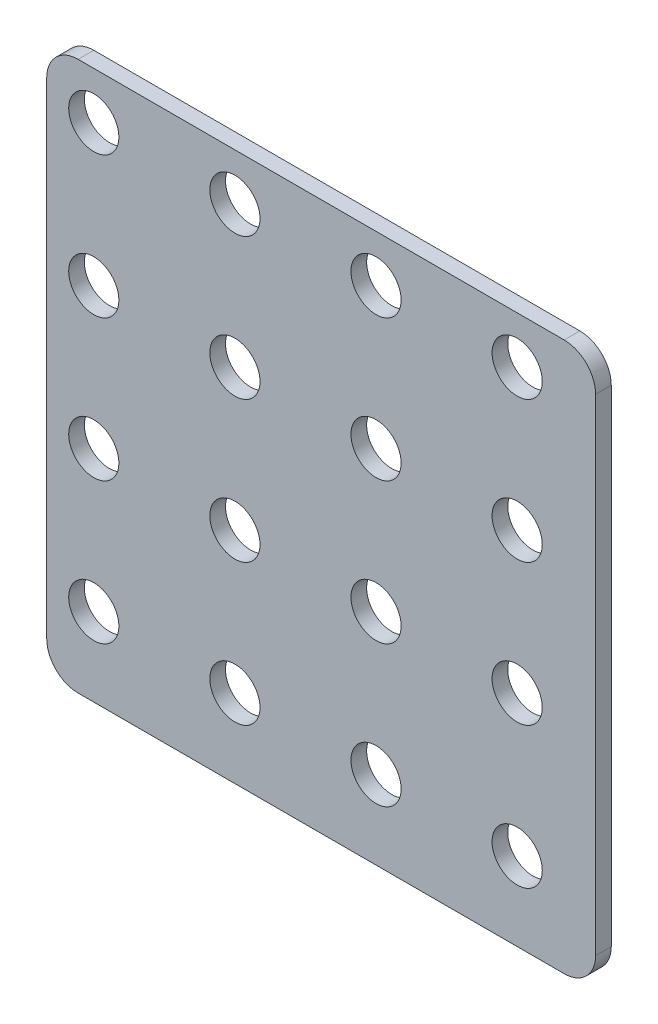
ISO-10303-21;
HEADER;
FILE_DESCRIPTION(('STEP AP214'),'2;1');
FILE_NAME('part.step','',(''),(''),'','','');
FILE_SCHEMA(('AUTOMOTIVE_DESIGN { 1 0 10303 214 1 1 1 1 }'));
ENDSEC;
DATA;
#1=APPLICATION_CONTEXT('core data for automotive mechanical design processes');
#2=APPLICATION_PROTOCOL_DEFINITION('international standard','automotive_design',2000,#1);
#3=PRODUCT_CONTEXT('',#1,'mechanical');
#4=PRODUCT('Part','Part','',(#3));
#5=PRODUCT_RELATED_PRODUCT_CATEGORY('part','',(#4));
#6=PRODUCT_DEFINITION_FORMATION('','',#4);
#7=PRODUCT_DEFINITION_CONTEXT('part definition',#1,'design');
#8=PRODUCT_DEFINITION('design','',#6,#7);
#9=PRODUCT_DEFINITION_SHAPE('','',#8);
#10=(LENGTH_UNIT() NAMED_UNIT(*) SI_UNIT(.MILLI.,.METRE.));
#11=(NAMED_UNIT(*) PLANE_ANGLE_UNIT() SI_UNIT($,.RADIAN.));
#12=(NAMED_UNIT(*) SI_UNIT($,.STERADIAN.) SOLID_ANGLE_UNIT());
#13=UNCERTAINTY_MEASURE_WITH_UNIT(LENGTH_MEASURE(1.E-05),#10,'distance_accuracy_value','');
#14=(GEOMETRIC_REPRESENTATION_CONTEXT(3) GLOBAL_UNCERTAINTY_ASSIGNED_CONTEXT((#13)) GLOBAL_UNIT_ASSIGNED_CONTEXT((#10,
#11,#12)) REPRESENTATION_CONTEXT('',''));
#15=CARTESIAN_POINT('',(0.,0.,0.));
#16=DIRECTION('',(0.,0.,1.));
#17=DIRECTION('',(1.,0.,0.));
#18=AXIS2_PLACEMENT_3D('',#15,#16,#17);
#19=CARTESIAN_POINT('',(30.,5.,0.));
#20=DIRECTION('',(0.,0.,1.));
#21=DIRECTION('',(1.,0.,0.));
#22=AXIS2_PLACEMENT_3D('',#19,#20,#21);
#23=CYLINDRICAL_SURFACE('',#22,1.6);
#24=CARTESIAN_POINT('',(30.,5.,0.));
#25=DIRECTION('',(0.,0.,1.));
#26=DIRECTION('',(1.,0.,0.));
#27=AXIS2_PLACEMENT_3D('',#24,#25,#26);
#28=CIRCLE('',#27,1.6);
#29=CARTESIAN_POINT('',(31.6,5.,0.));
#30=VERTEX_POINT('',#29);
#31=EDGE_CURVE('E262',#30,#30,#28,.T.);
#32=ORIENTED_EDGE('',*,*,#31,.F.);
#33=EDGE_LOOP('',(#32));
#34=FACE_BOUND('',#33,.T.);
#35=CARTESIAN_POINT('',(30.,5.,1.));
#36=DIRECTION('',(0.,0.,-1.));
#37=DIRECTION('',(-1.,0.,0.));
#38=AXIS2_PLACEMENT_3D('',#35,#36,#37);
#39=CIRCLE('',#38,1.6);
#40=CARTESIAN_POINT('',(28.4,5.,1.));
#41=VERTEX_POINT('',#40);
#42=EDGE_CURVE('E266',#41,#41,#39,.T.);
#43=ORIENTED_EDGE('',*,*,#42,.F.);
#44=EDGE_LOOP('',(#43));
#45=FACE_BOUND('',#44,.T.);
#46=ADVANCED_FACE('F45',(#34,#45),#23,.F.);
#47=CARTESIAN_POINT('',(21.,5.,0.));
#48=DIRECTION('',(0.,0.,1.));
#49=DIRECTION('',(1.,0.,0.));
#50=AXIS2_PLACEMENT_3D('',#47,#48,#49);
#51=CYLINDRICAL_SURFACE('',#50,1.6);
#52=CARTESIAN_POINT('',(21.,5.,0.));
#53=DIRECTION('',(0.,0.,1.));
#54=DIRECTION('',(1.,0.,0.));
#55=AXIS2_PLACEMENT_3D('',#52,#53,#54);
#56=CIRCLE('',#55,1.6);
#57=CARTESIAN_POINT('',(22.6,5.,0.));
#58=VERTEX_POINT('',#57);
#59=EDGE_CURVE('E254',#58,#58,#56,.T.);
#60=ORIENTED_EDGE('',*,*,#59,.F.);
#61=EDGE_LOOP('',(#60));
#62=FACE_BOUND('',#61,.T.);
#63=CARTESIAN_POINT('',(21.,5.,1.));
#64=DIRECTION('',(0.,0.,-1.));
#65=DIRECTION('',(-1.,0.,0.));
#66=AXIS2_PLACEMENT_3D('',#63,#64,#65);
#67=CIRCLE('',#66,1.6);
#68=CARTESIAN_POINT('',(19.4,5.,1.));
#69=VERTEX_POINT('',#68);
#70=EDGE_CURVE('E258',#69,#69,#67,.T.);
#71=ORIENTED_EDGE('',*,*,#70,.F.);
#72=EDGE_LOOP('',(#71));
#73=FACE_BOUND('',#72,.T.);
#74=ADVANCED_FACE('F374',(#62,#73),#51,.F.);
#75=CARTESIAN_POINT('',(12.,5.,0.));
#76=DIRECTION('',(0.,0.,1.));
#77=DIRECTION('',(1.,0.,0.));
#78=AXIS2_PLACEMENT_3D('',#75,#76,#77);
#79=CYLINDRICAL_SURFACE('',#78,1.6);
#80=CARTESIAN_POINT('',(12.,5.,0.));
#81=DIRECTION('',(0.,0.,1.));
#82=DIRECTION('',(1.,0.,0.));
#83=AXIS2_PLACEMENT_3D('',#80,#81,#82);
#84=CIRCLE('',#83,1.6);
#85=CARTESIAN_POINT('',(13.6,5.,0.));
#86=VERTEX_POINT('',#85);
#87=EDGE_CURVE('E246',#86,#86,#84,.T.);
#88=ORIENTED_EDGE('',*,*,#87,.F.);
#89=EDGE_LOOP('',(#88));
#90=FACE_BOUND('',#89,.T.);
#91=CARTESIAN_POINT('',(12.,5.,1.));
#92=DIRECTION('',(0.,0.,-1.));
#93=DIRECTION('',(-1.,0.,0.));
#94=AXIS2_PLACEMENT_3D('',#91,#92,#93);
#95=CIRCLE('',#94,1.6);
#96=CARTESIAN_POINT('',(10.4,5.,1.));
#97=VERTEX_POINT('',#96);
#98=EDGE_CURVE('E250',#97,#97,#95,.T.);
#99=ORIENTED_EDGE('',*,*,#98,.F.);
#100=EDGE_LOOP('',(#99));
#101=FACE_BOUND('',#100,.T.);
#102=ADVANCED_FACE('F381',(#90,#101),#79,.F.);
#103=CARTESIAN_POINT('',(3.,5.,0.));
#104=DIRECTION('',(0.,0.,1.));
#105=DIRECTION('',(1.,0.,0.));
#106=AXIS2_PLACEMENT_3D('',#103,#104,#105);
#107=CYLINDRICAL_SURFACE('',#106,1.6);
#108=CARTESIAN_POINT('',(3.,5.,0.));
#109=DIRECTION('',(0.,0.,1.));
#110=DIRECTION('',(1.,0.,0.));
#111=AXIS2_PLACEMENT_3D('',#108,#109,#110);
#112=CIRCLE('',#111,1.6);
#113=CARTESIAN_POINT('',(4.6,5.,0.));
#114=VERTEX_POINT('',#113);
#115=EDGE_CURVE('E238',#114,#114,#112,.T.);
#116=ORIENTED_EDGE('',*,*,#115,.F.);
#117=EDGE_LOOP('',(#116));
#118=FACE_BOUND('',#117,.T.);
#119=CARTESIAN_POINT('',(3.,5.,1.));
#120=DIRECTION('',(0.,0.,-1.));
#121=DIRECTION('',(-1.,0.,0.));
#122=AXIS2_PLACEMENT_3D('',#119,#120,#121);
#123=CIRCLE('',#122,1.6);
#124=CARTESIAN_POINT('',(1.4,5.,1.));
#125=VERTEX_POINT('',#124);
#126=EDGE_CURVE('E242',#125,#125,#123,.T.);
#127=ORIENTED_EDGE('',*,*,#126,.F.);
#128=EDGE_LOOP('',(#127));
#129=FACE_BOUND('',#128,.T.);
#130=ADVANCED_FACE('F454',(#118,#129),#107,.F.);
#131=CARTESIAN_POINT('',(30.,14.,0.));
#132=DIRECTION('',(0.,0.,1.));
#133=DIRECTION('',(1.,0.,0.));
#134=AXIS2_PLACEMENT_3D('',#131,#132,#133);
#135=CYLINDRICAL_SURFACE('',#134,1.6);
#136=CARTESIAN_POINT('',(30.,14.,0.));
#137=DIRECTION('',(0.,0.,1.));
#138=DIRECTION('',(1.,0.,0.));
#139=AXIS2_PLACEMENT_3D('',#136,#137,#138);
#140=CIRCLE('',#139,1.6);
#141=CARTESIAN_POINT('',(31.6,14.,0.));
#142=VERTEX_POINT('',#141);
#143=EDGE_CURVE('E230',#142,#142,#140,.T.);
#144=ORIENTED_EDGE('',*,*,#143,.F.);
#145=EDGE_LOOP('',(#144));
#146=FACE_BOUND('',#145,.T.);
#147=CARTESIAN_POINT('',(30.,14.,1.));
#148=DIRECTION('',(0.,0.,-1.));
#149=DIRECTION('',(-1.,0.,0.));
#150=AXIS2_PLACEMENT_3D('',#147,#148,#149);
#151=CIRCLE('',#150,1.6);
#152=CARTESIAN_POINT('',(28.4,14.,1.));
#153=VERTEX_POINT('',#152);
#154=EDGE_CURVE('E234',#153,#153,#151,.T.);
#155=ORIENTED_EDGE('',*,*,#154,.F.);
#156=EDGE_LOOP('',(#155));
#157=FACE_BOUND('',#156,.T.);
#158=ADVANCED_FACE('F450',(#146,#157),#135,.F.);
#159=CARTESIAN_POINT('',(21.,14.,0.));
#160=DIRECTION('',(0.,0.,1.));
#161=DIRECTION('',(1.,0.,0.));
#162=AXIS2_PLACEMENT_3D('',#159,#160,#161);
#163=CYLINDRICAL_SURFACE('',#162,1.6);
#164=CARTESIAN_POINT('',(21.,14.,0.));
#165=DIRECTION('',(0.,0.,1.));
#166=DIRECTION('',(1.,0.,0.));
#167=AXIS2_PLACEMENT_3D('',#164,#165,#166);
#168=CIRCLE('',#167,1.6);
#169=CARTESIAN_POINT('',(22.6,14.,0.));
#170=VERTEX_POINT('',#169);
#171=EDGE_CURVE('E222',#170,#170,#168,.T.);
#172=ORIENTED_EDGE('',*,*,#171,.F.);
#173=EDGE_LOOP('',(#172));
#174=FACE_BOUND('',#173,.T.);
#175=CARTESIAN_POINT('',(21.,14.,1.));
#176=DIRECTION('',(0.,0.,-1.));
#177=DIRECTION('',(-1.,0.,0.));
#178=AXIS2_PLACEMENT_3D('',#175,#176,#177);
#179=CIRCLE('',#178,1.6);
#180=CARTESIAN_POINT('',(19.4,14.,1.));
#181=VERTEX_POINT('',#180);
#182=EDGE_CURVE('E226',#181,#181,#179,.T.);
#183=ORIENTED_EDGE('',*,*,#182,.F.);
#184=EDGE_LOOP('',(#183));
#185=FACE_BOUND('',#184,.T.);
#186=ADVANCED_FACE('F446',(#174,#185),#163,.F.);
#187=CARTESIAN_POINT('',(12.,14.,0.));
#188=DIRECTION('',(0.,0.,1.));
#189=DIRECTION('',(1.,0.,0.));
#190=AXIS2_PLACEMENT_3D('',#187,#188,#189);
#191=CYLINDRICAL_SURFACE('',#190,1.6);
#192=CARTESIAN_POINT('',(12.,14.,0.));
#193=DIRECTION('',(0.,0.,1.));
#194=DIRECTION('',(1.,0.,0.));
#195=AXIS2_PLACEMENT_3D('',#192,#193,#194);
#196=CIRCLE('',#195,1.6);
#197=CARTESIAN_POINT('',(13.6,14.,0.));
#198=VERTEX_POINT('',#197);
#199=EDGE_CURVE('E214',#198,#198,#196,.T.);
#200=ORIENTED_EDGE('',*,*,#199,.F.);
#201=EDGE_LOOP('',(#200));
#202=FACE_BOUND('',#201,.T.);
#203=CARTESIAN_POINT('',(12.,14.,1.));
#204=DIRECTION('',(0.,0.,-1.));
#205=DIRECTION('',(-1.,0.,0.));
#206=AXIS2_PLACEMENT_3D('',#203,#204,#205);
#207=CIRCLE('',#206,1.6);
#208=CARTESIAN_POINT('',(10.4,14.,1.));
#209=VERTEX_POINT('',#208);
#210=EDGE_CURVE('E218',#209,#209,#207,.T.);
#211=ORIENTED_EDGE('',*,*,#210,.F.);
#212=EDGE_LOOP('',(#211));
#213=FACE_BOUND('',#212,.T.);
#214=ADVANCED_FACE('F442',(#202,#213),#191,.F.);
#215=CARTESIAN_POINT('',(3.,14.,0.));
#216=DIRECTION('',(0.,0.,1.));
#217=DIRECTION('',(1.,0.,0.));
#218=AXIS2_PLACEMENT_3D('',#215,#216,#217);
#219=CYLINDRICAL_SURFACE('',#218,1.6);
#220=CARTESIAN_POINT('',(3.,14.,0.));
#221=DIRECTION('',(0.,0.,1.));
#222=DIRECTION('',(1.,0.,0.));
#223=AXIS2_PLACEMENT_3D('',#220,#221,#222);
#224=CIRCLE('',#223,1.6);
#225=CARTESIAN_POINT('',(4.6,14.,0.));
#226=VERTEX_POINT('',#225);
#227=EDGE_CURVE('E206',#226,#226,#224,.T.);
#228=ORIENTED_EDGE('',*,*,#227,.F.);
#229=EDGE_LOOP('',(#228));
#230=FACE_BOUND('',#229,.T.);
#231=CARTESIAN_POINT('',(3.,14.,1.));
#232=DIRECTION('',(0.,0.,-1.));
#233=DIRECTION('',(-1.,0.,0.));
#234=AXIS2_PLACEMENT_3D('',#231,#232,#233);
#235=CIRCLE('',#234,1.6);
#236=CARTESIAN_POINT('',(1.4,14.,1.));
#237=VERTEX_POINT('',#236);
#238=EDGE_CURVE('E210',#237,#237,#235,.T.);
#239=ORIENTED_EDGE('',*,*,#238,.F.);
#240=EDGE_LOOP('',(#239));
#241=FACE_BOUND('',#240,.T.);
#242=ADVANCED_FACE('F438',(#230,#241),#219,.F.);
#243=CARTESIAN_POINT('',(30.,23.,0.));
#244=DIRECTION('',(0.,0.,1.));
#245=DIRECTION('',(1.,0.,0.));
#246=AXIS2_PLACEMENT_3D('',#243,#244,#245);
#247=CYLINDRICAL_SURFACE('',#246,1.6);
#248=CARTESIAN_POINT('',(30.,23.,0.));
#249=DIRECTION('',(0.,0.,1.));
#250=DIRECTION('',(1.,0.,0.));
#251=AXIS2_PLACEMENT_3D('',#248,#249,#250);
#252=CIRCLE('',#251,1.6);
#253=CARTESIAN_POINT('',(31.6,23.,0.));
#254=VERTEX_POINT('',#253);
#255=EDGE_CURVE('E198',#254,#254,#252,.T.);
#256=ORIENTED_EDGE('',*,*,#255,.F.);
#257=EDGE_LOOP('',(#256));
#258=FACE_BOUND('',#257,.T.);
#259=CARTESIAN_POINT('',(30.,23.,1.));
#260=DIRECTION('',(0.,0.,-1.));
#261=DIRECTION('',(-1.,0.,0.));
#262=AXIS2_PLACEMENT_3D('',#259,#260,#261);
#263=CIRCLE('',#262,1.6);
#264=CARTESIAN_POINT('',(28.4,23.,1.));
#265=VERTEX_POINT('',#264);
#266=EDGE_CURVE('E202',#265,#265,#263,.T.);
#267=ORIENTED_EDGE('',*,*,#266,.F.);
#268=EDGE_LOOP('',(#267));
#269=FACE_BOUND('',#268,.T.);
#270=ADVANCED_FACE('F434',(#258,#269),#247,.F.);
#271=CARTESIAN_POINT('',(21.,23.,0.));
#272=DIRECTION('',(0.,0.,1.));
#273=DIRECTION('',(1.,0.,0.));
#274=AXIS2_PLACEMENT_3D('',#271,#272,#273);
#275=CYLINDRICAL_SURFACE('',#274,1.6);
#276=CARTESIAN_POINT('',(21.,23.,0.));
#277=DIRECTION('',(0.,0.,1.));
#278=DIRECTION('',(1.,0.,0.));
#279=AXIS2_PLACEMENT_3D('',#276,#277,#278);
#280=CIRCLE('',#279,1.6);
#281=CARTESIAN_POINT('',(22.6,23.,0.));
#282=VERTEX_POINT('',#281);
#283=EDGE_CURVE('E190',#282,#282,#280,.T.);
#284=ORIENTED_EDGE('',*,*,#283,.F.);
#285=EDGE_LOOP('',(#284));
#286=FACE_BOUND('',#285,.T.);
#287=CARTESIAN_POINT('',(21.,23.,1.));
#288=DIRECTION('',(0.,0.,-1.));
#289=DIRECTION('',(-1.,0.,0.));
#290=AXIS2_PLACEMENT_3D('',#287,#288,#289);
#291=CIRCLE('',#290,1.6);
#292=CARTESIAN_POINT('',(19.4,23.,1.));
#293=VERTEX_POINT('',#292);
#294=EDGE_CURVE('E194',#293,#293,#291,.T.);
#295=ORIENTED_EDGE('',*,*,#294,.F.);
#296=EDGE_LOOP('',(#295));
#297=FACE_BOUND('',#296,.T.);
#298=ADVANCED_FACE('F430',(#286,#297),#275,.F.);
#299=CARTESIAN_POINT('',(12.,23.,0.));
#300=DIRECTION('',(0.,0.,1.));
#301=DIRECTION('',(1.,0.,0.));
#302=AXIS2_PLACEMENT_3D('',#299,#300,#301);
#303=CYLINDRICAL_SURFACE('',#302,1.6);
#304=CARTESIAN_POINT('',(12.,23.,0.));
#305=DIRECTION('',(0.,0.,1.));
#306=DIRECTION('',(1.,0.,0.));
#307=AXIS2_PLACEMENT_3D('',#304,#305,#306);
#308=CIRCLE('',#307,1.6);
#309=CARTESIAN_POINT('',(13.6,23.,0.));
#310=VERTEX_POINT('',#309);
#311=EDGE_CURVE('E182',#310,#310,#308,.T.);
#312=ORIENTED_EDGE('',*,*,#311,.F.);
#313=EDGE_LOOP('',(#312));
#314=FACE_BOUND('',#313,.T.);
#315=CARTESIAN_POINT('',(12.,23.,1.));
#316=DIRECTION('',(0.,0.,-1.));
#317=DIRECTION('',(-1.,0.,0.));
#318=AXIS2_PLACEMENT_3D('',#315,#316,#317);
#319=CIRCLE('',#318,1.6);
#320=CARTESIAN_POINT('',(10.4,23.,1.));
#321=VERTEX_POINT('',#320);
#322=EDGE_CURVE('E186',#321,#321,#319,.T.);
#323=ORIENTED_EDGE('',*,*,#322,.F.);
#324=EDGE_LOOP('',(#323));
#325=FACE_BOUND('',#324,.T.);
#326=ADVANCED_FACE('F426',(#314,#325),#303,.F.);
#327=CARTESIAN_POINT('',(3.,23.,0.));
#328=DIRECTION('',(0.,0.,1.));
#329=DIRECTION('',(1.,0.,0.));
#330=AXIS2_PLACEMENT_3D('',#327,#328,#329);
#331=CYLINDRICAL_SURFACE('',#330,1.6);
#332=CARTESIAN_POINT('',(3.,23.,0.));
#333=DIRECTION('',(0.,0.,1.));
#334=DIRECTION('',(1.,0.,0.));
#335=AXIS2_PLACEMENT_3D('',#332,#333,#334);
#336=CIRCLE('',#335,1.6);
#337=CARTESIAN_POINT('',(4.6,23.,0.));
#338=VERTEX_POINT('',#337);
#339=EDGE_CURVE('E174',#338,#338,#336,.T.);
#340=ORIENTED_EDGE('',*,*,#339,.F.);
#341=EDGE_LOOP('',(#340));
#342=FACE_BOUND('',#341,.T.);
#343=CARTESIAN_POINT('',(3.,23.,1.));
#344=DIRECTION('',(0.,0.,-1.));
#345=DIRECTION('',(-1.,0.,0.));
#346=AXIS2_PLACEMENT_3D('',#343,#344,#345);
#347=CIRCLE('',#346,1.6);
#348=CARTESIAN_POINT('',(1.4,23.,1.));
#349=VERTEX_POINT('',#348);
#350=EDGE_CURVE('E178',#349,#349,#347,.T.);
#351=ORIENTED_EDGE('',*,*,#350,.F.);
#352=EDGE_LOOP('',(#351));
#353=FACE_BOUND('',#352,.T.);
#354=ADVANCED_FACE('F422',(#342,#353),#331,.F.);
#355=CARTESIAN_POINT('',(30.,32.,0.));
#356=DIRECTION('',(0.,0.,1.));
#357=DIRECTION('',(1.,0.,0.));
#358=AXIS2_PLACEMENT_3D('',#355,#356,#357);
#359=CYLINDRICAL_SURFACE('',#358,1.6);
#360=CARTESIAN_POINT('',(30.,32.,0.));
#361=DIRECTION('',(0.,0.,1.));
#362=DIRECTION('',(1.,0.,0.));
#363=AXIS2_PLACEMENT_3D('',#360,#361,#362);
#364=CIRCLE('',#363,1.6);
#365=CARTESIAN_POINT('',(31.6,32.,0.));
#366=VERTEX_POINT('',#365);
#367=EDGE_CURVE('E166',#366,#366,#364,.T.);
#368=ORIENTED_EDGE('',*,*,#367,.F.);
#369=EDGE_LOOP('',(#368));
#370=FACE_BOUND('',#369,.T.);
#371=CARTESIAN_POINT('',(30.,32.,1.));
#372=DIRECTION('',(0.,0.,-1.));
#373=DIRECTION('',(-1.,0.,0.));
#374=AXIS2_PLACEMENT_3D('',#371,#372,#373);
#375=CIRCLE('',#374,1.6);
#376=CARTESIAN_POINT('',(28.4,32.,1.));
#377=VERTEX_POINT('',#376);
#378=EDGE_CURVE('E170',#377,#377,#375,.T.);
#379=ORIENTED_EDGE('',*,*,#378,.F.);
#380=EDGE_LOOP('',(#379));
#381=FACE_BOUND('',#380,.T.);
#382=ADVANCED_FACE('F415',(#370,#381),#359,.F.);
#383=CARTESIAN_POINT('',(21.,32.,0.));
#384=DIRECTION('',(0.,0.,1.));
#385=DIRECTION('',(1.,0.,0.));
#386=AXIS2_PLACEMENT_3D('',#383,#384,#385);
#387=CYLINDRICAL_SURFACE('',#386,1.6);
#388=CARTESIAN_POINT('',(21.,32.,0.));
#389=DIRECTION('',(0.,0.,1.));
#390=DIRECTION('',(1.,0.,0.));
#391=AXIS2_PLACEMENT_3D('',#388,#389,#390);
#392=CIRCLE('',#391,1.6);
#393=CARTESIAN_POINT('',(22.6,32.,0.));
#394=VERTEX_POINT('',#393);
#395=EDGE_CURVE('E157',#394,#394,#392,.T.);
#396=ORIENTED_EDGE('',*,*,#395,.F.);
#397=EDGE_LOOP('',(#396));
#398=FACE_BOUND('',#397,.T.);
#399=CARTESIAN_POINT('',(21.,32.,1.));
#400=DIRECTION('',(0.,0.,-1.));
#401=DIRECTION('',(-1.,0.,0.));
#402=AXIS2_PLACEMENT_3D('',#399,#400,#401);
#403=CIRCLE('',#402,1.6);
#404=CARTESIAN_POINT('',(19.4,32.,1.));
#405=VERTEX_POINT('',#404);
#406=EDGE_CURVE('E161',#405,#405,#403,.T.);
#407=ORIENTED_EDGE('',*,*,#406,.F.);
#408=EDGE_LOOP('',(#407));
#409=FACE_BOUND('',#408,.T.);
#410=ADVANCED_FACE('F407',(#398,#409),#387,.F.);
#411=CARTESIAN_POINT('',(0.,0.,1.));
#412=DIRECTION('',(1.,0.,0.));
#413=DIRECTION('',(0.,0.,-1.));
#414=AXIS2_PLACEMENT_3D('',#411,#412,#413);
#415=PLANE('',#414);
#416=DIRECTION('',(0.,-1.,0.));
#417=VECTOR('',#416,1.);
#418=CARTESIAN_POINT('',(0.,0.,0.));
#419=LINE('',#418,#417);
#420=CARTESIAN_POINT('',(0.,33.,0.));
#421=VERTEX_POINT('',#420);
#422=CARTESIAN_POINT('',(0.,2.,0.));
#423=VERTEX_POINT('',#422);
#424=EDGE_CURVE('E143',#421,#423,#419,.T.);
#425=ORIENTED_EDGE('',*,*,#424,.T.);
#426=DIRECTION('',(0.,0.,-1.));
#427=VECTOR('',#426,1.);
#428=CARTESIAN_POINT('',(0.,2.,1.));
#429=LINE('',#428,#427);
#430=CARTESIAN_POINT('',(0.,2.,1.));
#431=VERTEX_POINT('',#430);
#432=EDGE_CURVE('E117',#423,#431,#429,.F.);
#433=ORIENTED_EDGE('',*,*,#432,.T.);
#434=DIRECTION('',(0.,-1.,0.));
#435=VECTOR('',#434,1.);
#436=CARTESIAN_POINT('',(0.,0.,1.));
#437=LINE('',#436,#435);
#438=CARTESIAN_POINT('',(0.,33.,1.));
#439=VERTEX_POINT('',#438);
#440=EDGE_CURVE('E156',#439,#431,#437,.T.);
#441=ORIENTED_EDGE('',*,*,#440,.F.);
#442=DIRECTION('',(0.,0.,-1.));
#443=VECTOR('',#442,1.);
#444=CARTESIAN_POINT('',(0.,33.,1.));
#445=LINE('',#444,#443);
#446=EDGE_CURVE('E123',#439,#421,#445,.T.);
#447=ORIENTED_EDGE('',*,*,#446,.T.);
#448=EDGE_LOOP('',(#425,#433,#441,#447));
#449=FACE_BOUND('',#448,.T.);
#450=ADVANCED_FACE('F405',(#449),#415,.F.);
#451=CARTESIAN_POINT('',(0.,0.,1.));
#452=DIRECTION('',(0.,1.,0.));
#453=DIRECTION('',(0.,0.,1.));
#454=AXIS2_PLACEMENT_3D('',#451,#452,#453);
#455=PLANE('',#454);
#456=DIRECTION('',(1.,0.,0.));
#457=VECTOR('',#456,1.);
#458=CARTESIAN_POINT('',(0.,0.,1.));
#459=LINE('',#458,#457);
#460=CARTESIAN_POINT('',(2.,0.,1.));
#461=VERTEX_POINT('',#460);
#462=CARTESIAN_POINT('',(33.,0.,1.));
#463=VERTEX_POINT('',#462);
#464=EDGE_CURVE('E133',#461,#463,#459,.T.);
#465=ORIENTED_EDGE('',*,*,#464,.F.);
#466=DIRECTION('',(0.,0.,-1.));
#467=VECTOR('',#466,1.);
#468=CARTESIAN_POINT('',(2.,0.,1.));
#469=LINE('',#468,#467);
#470=CARTESIAN_POINT('',(2.,0.,0.));
#471=VERTEX_POINT('',#470);
#472=EDGE_CURVE('E116',#461,#471,#469,.T.);
#473=ORIENTED_EDGE('',*,*,#472,.T.);
#474=DIRECTION('',(1.,0.,0.));
#475=VECTOR('',#474,1.);
#476=CARTESIAN_POINT('',(0.,0.,0.));
#477=LINE('',#476,#475);
#478=CARTESIAN_POINT('',(33.,0.,0.));
#479=VERTEX_POINT('',#478);
#480=EDGE_CURVE('E130',#471,#479,#477,.T.);
#481=ORIENTED_EDGE('',*,*,#480,.T.);
#482=DIRECTION('',(0.,0.,-1.));
#483=VECTOR('',#482,1.);
#484=CARTESIAN_POINT('',(33.,0.,1.));
#485=LINE('',#484,#483);
#486=EDGE_CURVE('E136',#479,#463,#485,.F.);
#487=ORIENTED_EDGE('',*,*,#486,.T.);
#488=EDGE_LOOP('',(#465,#473,#481,#487));
#489=FACE_BOUND('',#488,.T.);
#490=ADVANCED_FACE('F129',(#489),#455,.F.);
#491=CARTESIAN_POINT('',(35.,0.,1.));
#492=DIRECTION('',(-1.,0.,0.));
#493=DIRECTION('',(0.,0.,1.));
#494=AXIS2_PLACEMENT_3D('',#491,#492,#493);
#495=PLANE('',#494);
#496=DIRECTION('',(0.,1.,0.));
#497=VECTOR('',#496,1.);
#498=CARTESIAN_POINT('',(35.,0.,1.));
#499=LINE('',#498,#497);
#500=CARTESIAN_POINT('',(35.,2.,1.));
#501=VERTEX_POINT('',#500);
#502=CARTESIAN_POINT('',(35.,33.,1.));
#503=VERTEX_POINT('',#502);
#504=EDGE_CURVE('E304',#501,#503,#499,.T.);
#505=ORIENTED_EDGE('',*,*,#504,.F.);
#506=DIRECTION('',(0.,0.,-1.));
#507=VECTOR('',#506,1.);
#508=CARTESIAN_POINT('',(35.,2.,1.));
#509=LINE('',#508,#507);
#510=CARTESIAN_POINT('',(35.,2.,0.));
#511=VERTEX_POINT('',#510);
#512=EDGE_CURVE('E298',#501,#511,#509,.T.);
#513=ORIENTED_EDGE('',*,*,#512,.T.);
#514=DIRECTION('',(0.,1.,0.));
#515=VECTOR('',#514,1.);
#516=CARTESIAN_POINT('',(35.,0.,0.));
#517=LINE('',#516,#515);
#518=CARTESIAN_POINT('',(35.,33.,0.));
#519=VERTEX_POINT('',#518);
#520=EDGE_CURVE('E142',#511,#519,#517,.T.);
#521=ORIENTED_EDGE('',*,*,#520,.T.);
#522=DIRECTION('',(0.,0.,-1.));
#523=VECTOR('',#522,1.);
#524=CARTESIAN_POINT('',(35.,33.,1.));
#525=LINE('',#524,#523);
#526=EDGE_CURVE('E295',#519,#503,#525,.F.);
#527=ORIENTED_EDGE('',*,*,#526,.T.);
#528=EDGE_LOOP('',(#505,#513,#521,#527));
#529=FACE_BOUND('',#528,.T.);
#530=ADVANCED_FACE('F412',(#529),#495,.F.);
#531=CARTESIAN_POINT('',(0.,35.,1.));
#532=DIRECTION('',(0.,-1.,0.));
#533=DIRECTION('',(0.,0.,-1.));
#534=AXIS2_PLACEMENT_3D('',#531,#532,#533);
#535=PLANE('',#534);
#536=DIRECTION('',(-1.,0.,0.));
#537=VECTOR('',#536,1.);
#538=CARTESIAN_POINT('',(0.,35.,1.));
#539=LINE('',#538,#537);
#540=CARTESIAN_POINT('',(33.,35.,1.));
#541=VERTEX_POINT('',#540);
#542=CARTESIAN_POINT('',(2.,35.,1.));
#543=VERTEX_POINT('',#542);
#544=EDGE_CURVE('E162',#541,#543,#539,.T.);
#545=ORIENTED_EDGE('',*,*,#544,.F.);
#546=DIRECTION('',(0.,0.,-1.));
#547=VECTOR('',#546,1.);
#548=CARTESIAN_POINT('',(33.,35.,1.));
#549=LINE('',#548,#547);
#550=CARTESIAN_POINT('',(33.,35.,0.));
#551=VERTEX_POINT('',#550);
#552=EDGE_CURVE('E11',#541,#551,#549,.T.);
#553=ORIENTED_EDGE('',*,*,#552,.T.);
#554=DIRECTION('',(-1.,0.,0.));
#555=VECTOR('',#554,1.);
#556=CARTESIAN_POINT('',(0.,35.,0.));
#557=LINE('',#556,#555);
#558=CARTESIAN_POINT('',(2.,35.,0.));
#559=VERTEX_POINT('',#558);
#560=EDGE_CURVE('E148',#551,#559,#557,.T.);
#561=ORIENTED_EDGE('',*,*,#560,.T.);
#562=DIRECTION('',(0.,0.,-1.));
#563=VECTOR('',#562,1.);
#564=CARTESIAN_POINT('',(2.,35.,1.));
#565=LINE('',#564,#563);
#566=EDGE_CURVE('E54',#559,#543,#565,.F.);
#567=ORIENTED_EDGE('',*,*,#566,.T.);
#568=EDGE_LOOP('',(#545,#553,#561,#567));
#569=FACE_BOUND('',#568,.T.);
#570=ADVANCED_FACE('F341',(#569),#535,.F.);
#571=CARTESIAN_POINT('',(0.,0.,1.));
#572=DIRECTION('',(0.,0.,-1.));
#573=DIRECTION('',(-1.,0.,0.));
#574=AXIS2_PLACEMENT_3D('',#571,#572,#573);
#575=PLANE('',#574);
#576=CARTESIAN_POINT('',(12.,32.,1.));
#577=DIRECTION('',(0.,0.,-1.));
#578=DIRECTION('',(-1.,0.,0.));
#579=AXIS2_PLACEMENT_3D('',#576,#577,#578);
#580=CIRCLE('',#579,1.6);
#581=CARTESIAN_POINT('',(10.4,32.,1.));
#582=VERTEX_POINT('',#581);
#583=EDGE_CURVE('E320',#582,#582,#580,.T.);
#584=ORIENTED_EDGE('',*,*,#583,.T.);
#585=EDGE_LOOP('',(#584));
#586=FACE_BOUND('',#585,.T.);
#587=CARTESIAN_POINT('',(3.,32.,1.));
#588=DIRECTION('',(0.,0.,-1.));
#589=DIRECTION('',(-1.,0.,0.));
#590=AXIS2_PLACEMENT_3D('',#587,#588,#589);
#591=CIRCLE('',#590,1.6);
#592=CARTESIAN_POINT('',(1.4,32.,1.));
#593=VERTEX_POINT('',#592);
#594=EDGE_CURVE('E150',#593,#593,#591,.T.);
#595=ORIENTED_EDGE('',*,*,#594,.T.);
#596=EDGE_LOOP('',(#595));
#597=FACE_BOUND('',#596,.T.);
#598=ORIENTED_EDGE('',*,*,#440,.T.);
#599=CARTESIAN_POINT('',(2.,2.,1.));
#600=DIRECTION('',(0.,0.,-1.));
#601=DIRECTION('',(-1.,0.,0.));
#602=AXIS2_PLACEMENT_3D('',#599,#600,#601);
#603=CIRCLE('',#602,2.);
#604=EDGE_CURVE('E292',#431,#461,#603,.F.);
#605=ORIENTED_EDGE('',*,*,#604,.T.);
#606=ORIENTED_EDGE('',*,*,#464,.T.);
#607=CARTESIAN_POINT('',(33.,2.,1.));
#608=DIRECTION('',(0.,0.,-1.));
#609=DIRECTION('',(-1.,0.,0.));
#610=AXIS2_PLACEMENT_3D('',#607,#608,#609);
#611=CIRCLE('',#610,2.);
#612=EDGE_CURVE('E289',#463,#501,#611,.F.);
#613=ORIENTED_EDGE('',*,*,#612,.T.);
#614=ORIENTED_EDGE('',*,*,#504,.T.);
#615=CARTESIAN_POINT('',(33.,33.,1.));
#616=DIRECTION('',(0.,0.,-1.));
#617=DIRECTION('',(-1.,0.,0.));
#618=AXIS2_PLACEMENT_3D('',#615,#616,#617);
#619=CIRCLE('',#618,2.);
#620=EDGE_CURVE('E67',#503,#541,#619,.F.);
#621=ORIENTED_EDGE('',*,*,#620,.T.);
#622=ORIENTED_EDGE('',*,*,#544,.T.);
#623=CARTESIAN_POINT('',(2.,33.,1.));
#624=DIRECTION('',(0.,0.,-1.));
#625=DIRECTION('',(-1.,0.,0.));
#626=AXIS2_PLACEMENT_3D('',#623,#624,#625);
#627=CIRCLE('',#626,2.);
#628=EDGE_CURVE('E284',#543,#439,#627,.F.);
#629=ORIENTED_EDGE('',*,*,#628,.T.);
#630=EDGE_LOOP('',(#598,#605,#606,#613,#614,#621,#622,#629));
#631=FACE_BOUND('',#630,.T.);
#632=ORIENTED_EDGE('',*,*,#406,.T.);
#633=EDGE_LOOP('',(#632));
#634=FACE_BOUND('',#633,.T.);
#635=ORIENTED_EDGE('',*,*,#378,.T.);
#636=EDGE_LOOP('',(#635));
#637=FACE_BOUND('',#636,.T.);
#638=ORIENTED_EDGE('',*,*,#350,.T.);
#639=EDGE_LOOP('',(#638));
#640=FACE_BOUND('',#639,.T.);
#641=ORIENTED_EDGE('',*,*,#322,.T.);
#642=EDGE_LOOP('',(#641));
#643=FACE_BOUND('',#642,.T.);
#644=ORIENTED_EDGE('',*,*,#294,.T.);
#645=EDGE_LOOP('',(#644));
#646=FACE_BOUND('',#645,.T.);
#647=ORIENTED_EDGE('',*,*,#266,.T.);
#648=EDGE_LOOP('',(#647));
#649=FACE_BOUND('',#648,.T.);
#650=ORIENTED_EDGE('',*,*,#238,.T.);
#651=EDGE_LOOP('',(#650));
#652=FACE_BOUND('',#651,.T.);
#653=ORIENTED_EDGE('',*,*,#210,.T.);
#654=EDGE_LOOP('',(#653));
#655=FACE_BOUND('',#654,.T.);
#656=ORIENTED_EDGE('',*,*,#182,.T.);
#657=EDGE_LOOP('',(#656));
#658=FACE_BOUND('',#657,.T.);
#659=ORIENTED_EDGE('',*,*,#154,.T.);
#660=EDGE_LOOP('',(#659));
#661=FACE_BOUND('',#660,.T.);
#662=ORIENTED_EDGE('',*,*,#126,.T.);
#663=EDGE_LOOP('',(#662));
#664=FACE_BOUND('',#663,.T.);
#665=ORIENTED_EDGE('',*,*,#98,.T.);
#666=EDGE_LOOP('',(#665));
#667=FACE_BOUND('',#666,.T.);
#668=ORIENTED_EDGE('',*,*,#70,.T.);
#669=EDGE_LOOP('',(#668));
#670=FACE_BOUND('',#669,.T.);
#671=ORIENTED_EDGE('',*,*,#42,.T.);
#672=EDGE_LOOP('',(#671));
#673=FACE_BOUND('',#672,.T.);
#674=ADVANCED_FACE('F338',(#586,#597,#631,#634,#637,#640,#643,#646,#649,#652,#655,#658,#661,
#664,#667,#670,#673),#575,.F.);
#675=CARTESIAN_POINT('',(0.,0.,0.));
#676=DIRECTION('',(0.,0.,-1.));
#677=DIRECTION('',(-1.,0.,0.));
#678=AXIS2_PLACEMENT_3D('',#675,#676,#677);
#679=PLANE('',#678);
#680=CARTESIAN_POINT('',(12.,32.,0.));
#681=DIRECTION('',(0.,0.,1.));
#682=DIRECTION('',(1.,0.,0.));
#683=AXIS2_PLACEMENT_3D('',#680,#681,#682);
#684=CIRCLE('',#683,1.6);
#685=CARTESIAN_POINT('',(13.6,32.,0.));
#686=VERTEX_POINT('',#685);
#687=EDGE_CURVE('E324',#686,#686,#684,.T.);
#688=ORIENTED_EDGE('',*,*,#687,.T.);
#689=EDGE_LOOP('',(#688));
#690=FACE_BOUND('',#689,.T.);
#691=CARTESIAN_POINT('',(3.,32.,0.));
#692=DIRECTION('',(0.,0.,1.));
#693=DIRECTION('',(1.,0.,0.));
#694=AXIS2_PLACEMENT_3D('',#691,#692,#693);
#695=CIRCLE('',#694,1.6);
#696=CARTESIAN_POINT('',(4.6,32.,0.));
#697=VERTEX_POINT('',#696);
#698=EDGE_CURVE('E316',#697,#697,#695,.T.);
#699=ORIENTED_EDGE('',*,*,#698,.T.);
#700=EDGE_LOOP('',(#699));
#701=FACE_BOUND('',#700,.T.);
#702=ORIENTED_EDGE('',*,*,#480,.F.);
#703=CARTESIAN_POINT('',(2.,2.,0.));
#704=DIRECTION('',(0.,0.,-1.));
#705=DIRECTION('',(-1.,0.,0.));
#706=AXIS2_PLACEMENT_3D('',#703,#704,#705);
#707=CIRCLE('',#706,2.);
#708=EDGE_CURVE('E112',#471,#423,#707,.T.);
#709=ORIENTED_EDGE('',*,*,#708,.T.);
#710=ORIENTED_EDGE('',*,*,#424,.F.);
#711=CARTESIAN_POINT('',(2.,33.,0.));
#712=DIRECTION('',(0.,0.,-1.));
#713=DIRECTION('',(-1.,0.,0.));
#714=AXIS2_PLACEMENT_3D('',#711,#712,#713);
#715=CIRCLE('',#714,2.);
#716=EDGE_CURVE('E135',#421,#559,#715,.T.);
#717=ORIENTED_EDGE('',*,*,#716,.T.);
#718=ORIENTED_EDGE('',*,*,#560,.F.);
#719=CARTESIAN_POINT('',(33.,33.,0.));
#720=DIRECTION('',(0.,0.,-1.));
#721=DIRECTION('',(-1.,0.,0.));
#722=AXIS2_PLACEMENT_3D('',#719,#720,#721);
#723=CIRCLE('',#722,2.);
#724=EDGE_CURVE('E274',#551,#519,#723,.T.);
#725=ORIENTED_EDGE('',*,*,#724,.T.);
#726=ORIENTED_EDGE('',*,*,#520,.F.);
#727=CARTESIAN_POINT('',(33.,2.,0.));
#728=DIRECTION('',(0.,0.,-1.));
#729=DIRECTION('',(-1.,0.,0.));
#730=AXIS2_PLACEMENT_3D('',#727,#728,#729);
#731=CIRCLE('',#730,2.);
#732=EDGE_CURVE('E124',#511,#479,#731,.T.);
#733=ORIENTED_EDGE('',*,*,#732,.T.);
#734=EDGE_LOOP('',(#702,#709,#710,#717,#718,#725,#726,#733));
#735=FACE_BOUND('',#734,.T.);
#736=ORIENTED_EDGE('',*,*,#395,.T.);
#737=EDGE_LOOP('',(#736));
#738=FACE_BOUND('',#737,.T.);
#739=ORIENTED_EDGE('',*,*,#367,.T.);
#740=EDGE_LOOP('',(#739));
#741=FACE_BOUND('',#740,.T.);
#742=ORIENTED_EDGE('',*,*,#339,.T.);
#743=EDGE_LOOP('',(#742));
#744=FACE_BOUND('',#743,.T.);
#745=ORIENTED_EDGE('',*,*,#311,.T.);
#746=EDGE_LOOP('',(#745));
#747=FACE_BOUND('',#746,.T.);
#748=ORIENTED_EDGE('',*,*,#283,.T.);
#749=EDGE_LOOP('',(#748));
#750=FACE_BOUND('',#749,.T.);
#751=ORIENTED_EDGE('',*,*,#255,.T.);
#752=EDGE_LOOP('',(#751));
#753=FACE_BOUND('',#752,.T.);
#754=ORIENTED_EDGE('',*,*,#227,.T.);
#755=EDGE_LOOP('',(#754));
#756=FACE_BOUND('',#755,.T.);
#757=ORIENTED_EDGE('',*,*,#199,.T.);
#758=EDGE_LOOP('',(#757));
#759=FACE_BOUND('',#758,.T.);
#760=ORIENTED_EDGE('',*,*,#171,.T.);
#761=EDGE_LOOP('',(#760));
#762=FACE_BOUND('',#761,.T.);
#763=ORIENTED_EDGE('',*,*,#143,.T.);
#764=EDGE_LOOP('',(#763));
#765=FACE_BOUND('',#764,.T.);
#766=ORIENTED_EDGE('',*,*,#115,.T.);
#767=EDGE_LOOP('',(#766));
#768=FACE_BOUND('',#767,.T.);
#769=ORIENTED_EDGE('',*,*,#87,.T.);
#770=EDGE_LOOP('',(#769));
#771=FACE_BOUND('',#770,.T.);
#772=ORIENTED_EDGE('',*,*,#59,.T.);
#773=EDGE_LOOP('',(#772));
#774=FACE_BOUND('',#773,.T.);
#775=ORIENTED_EDGE('',*,*,#31,.T.);
#776=EDGE_LOOP('',(#775));
#777=FACE_BOUND('',#776,.T.);
#778=ADVANCED_FACE('F138',(#690,#701,#735,#738,#741,#744,#747,#750,#753,#756,#759,#762,#765,
#768,#771,#774,#777),#679,.T.);
#779=CARTESIAN_POINT('',(3.,32.,0.));
#780=DIRECTION('',(0.,0.,1.));
#781=DIRECTION('',(1.,0.,0.));
#782=AXIS2_PLACEMENT_3D('',#779,#780,#781);
#783=CYLINDRICAL_SURFACE('',#782,1.6);
#784=ORIENTED_EDGE('',*,*,#698,.F.);
#785=EDGE_LOOP('',(#784));
#786=FACE_BOUND('',#785,.T.);
#787=ORIENTED_EDGE('',*,*,#594,.F.);
#788=EDGE_LOOP('',(#787));
#789=FACE_BOUND('',#788,.T.);
#790=ADVANCED_FACE('F334',(#786,#789),#783,.F.);
#791=CARTESIAN_POINT('',(12.,32.,0.));
#792=DIRECTION('',(0.,0.,1.));
#793=DIRECTION('',(1.,0.,0.));
#794=AXIS2_PLACEMENT_3D('',#791,#792,#793);
#795=CYLINDRICAL_SURFACE('',#794,1.6);
#796=ORIENTED_EDGE('',*,*,#687,.F.);
#797=EDGE_LOOP('',(#796));
#798=FACE_BOUND('',#797,.T.);
#799=ORIENTED_EDGE('',*,*,#583,.F.);
#800=EDGE_LOOP('',(#799));
#801=FACE_BOUND('',#800,.T.);
#802=ADVANCED_FACE('F331',(#798,#801),#795,.F.);
#803=CARTESIAN_POINT('',(2.,2.,1.));
#804=DIRECTION('',(0.,0.,-1.));
#805=DIRECTION('',(-1.,0.,0.));
#806=AXIS2_PLACEMENT_3D('',#803,#804,#805);
#807=CYLINDRICAL_SURFACE('',#806,2.);
#808=ORIENTED_EDGE('',*,*,#604,.F.);
#809=ORIENTED_EDGE('',*,*,#432,.F.);
#810=ORIENTED_EDGE('',*,*,#708,.F.);
#811=ORIENTED_EDGE('',*,*,#472,.F.);
#812=EDGE_LOOP('',(#808,#809,#810,#811));
#813=FACE_BOUND('',#812,.T.);
#814=ADVANCED_FACE('F115',(#813),#807,.T.);
#815=CARTESIAN_POINT('',(33.,2.,1.));
#816=DIRECTION('',(0.,0.,-1.));
#817=DIRECTION('',(-1.,0.,0.));
#818=AXIS2_PLACEMENT_3D('',#815,#816,#817);
#819=CYLINDRICAL_SURFACE('',#818,2.);
#820=ORIENTED_EDGE('',*,*,#612,.F.);
#821=ORIENTED_EDGE('',*,*,#486,.F.);
#822=ORIENTED_EDGE('',*,*,#732,.F.);
#823=ORIENTED_EDGE('',*,*,#512,.F.);
#824=EDGE_LOOP('',(#820,#821,#822,#823));
#825=FACE_BOUND('',#824,.T.);
#826=ADVANCED_FACE('F389',(#825),#819,.T.);
#827=CARTESIAN_POINT('',(33.,33.,1.));
#828=DIRECTION('',(0.,0.,-1.));
#829=DIRECTION('',(-1.,0.,0.));
#830=AXIS2_PLACEMENT_3D('',#827,#828,#829);
#831=CYLINDRICAL_SURFACE('',#830,2.);
#832=ORIENTED_EDGE('',*,*,#620,.F.);
#833=ORIENTED_EDGE('',*,*,#526,.F.);
#834=ORIENTED_EDGE('',*,*,#724,.F.);
#835=ORIENTED_EDGE('',*,*,#552,.F.);
#836=EDGE_LOOP('',(#832,#833,#834,#835));
#837=FACE_BOUND('',#836,.T.);
#838=ADVANCED_FACE('F391',(#837),#831,.T.);
#839=CARTESIAN_POINT('',(2.,33.,1.));
#840=DIRECTION('',(0.,0.,-1.));
#841=DIRECTION('',(-1.,0.,0.));
#842=AXIS2_PLACEMENT_3D('',#839,#840,#841);
#843=CYLINDRICAL_SURFACE('',#842,2.);
#844=ORIENTED_EDGE('',*,*,#628,.F.);
#845=ORIENTED_EDGE('',*,*,#566,.F.);
#846=ORIENTED_EDGE('',*,*,#716,.F.);
#847=ORIENTED_EDGE('',*,*,#446,.F.);
#848=EDGE_LOOP('',(#844,#845,#846,#847));
#849=FACE_BOUND('',#848,.T.);
#850=ADVANCED_FACE('F47',(#849),#843,.T.);
#851=CLOSED_SHELL('',(#46,#74,#102,#130,#158,#186,#214,#242,#270,#298,#326,#354,#382,#410,#450,
#490,#530,#570,#674,#778,#790,#802,#814,#826,#838,#850));
#852=MANIFOLD_SOLID_BREP('B2',#851);
#853=ADVANCED_BREP_SHAPE_REPRESENTATION('',(#18,#852),#14);
#854=SHAPE_DEFINITION_REPRESENTATION(#9,#853);
ENDSEC;
END-ISO-10303-21;
